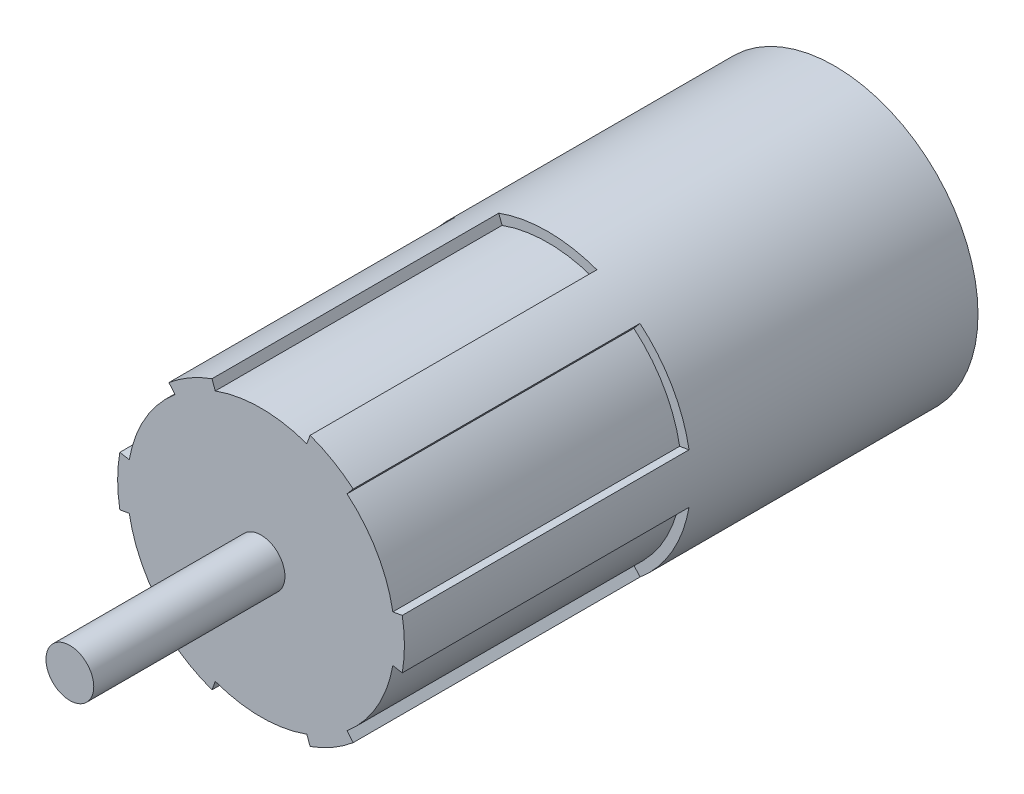
ISO-10303-21;
HEADER;
FILE_DESCRIPTION(('STEP AP214'),'2;1');
FILE_NAME('part.step','',(''),(''),'','','');
FILE_SCHEMA(('AUTOMOTIVE_DESIGN { 1 0 10303 214 1 1 1 1 }'));
ENDSEC;
DATA;
#1=APPLICATION_CONTEXT('core data for automotive mechanical design processes');
#2=APPLICATION_PROTOCOL_DEFINITION('international standard','automotive_design',2000,#1);
#3=PRODUCT_CONTEXT('',#1,'mechanical');
#4=PRODUCT('Part','Part','',(#3));
#5=PRODUCT_RELATED_PRODUCT_CATEGORY('part','',(#4));
#6=PRODUCT_DEFINITION_FORMATION('','',#4);
#7=PRODUCT_DEFINITION_CONTEXT('part definition',#1,'design');
#8=PRODUCT_DEFINITION('design','',#6,#7);
#9=PRODUCT_DEFINITION_SHAPE('','',#8);
#10=(LENGTH_UNIT() NAMED_UNIT(*) SI_UNIT(.MILLI.,.METRE.));
#11=(NAMED_UNIT(*) PLANE_ANGLE_UNIT() SI_UNIT($,.RADIAN.));
#12=(NAMED_UNIT(*) SI_UNIT($,.STERADIAN.) SOLID_ANGLE_UNIT());
#13=UNCERTAINTY_MEASURE_WITH_UNIT(LENGTH_MEASURE(1.E-05),#10,'distance_accuracy_value','');
#14=(GEOMETRIC_REPRESENTATION_CONTEXT(3) GLOBAL_UNCERTAINTY_ASSIGNED_CONTEXT((#13)) GLOBAL_UNIT_ASSIGNED_CONTEXT((#10,
#11,#12)) REPRESENTATION_CONTEXT('',''));
#15=CARTESIAN_POINT('',(0.,0.,0.));
#16=DIRECTION('',(0.,0.,1.));
#17=DIRECTION('',(1.,0.,0.));
#18=AXIS2_PLACEMENT_3D('',#15,#16,#17);
#19=CARTESIAN_POINT('',(0.,0.,30.));
#20=DIRECTION('',(0.,0.,-1.));
#21=DIRECTION('',(-1.,0.,0.));
#22=AXIS2_PLACEMENT_3D('',#19,#20,#21);
#23=CYLINDRICAL_SURFACE('',#22,15.);
#24=CARTESIAN_POINT('',(0.,0.,30.));
#25=DIRECTION('',(0.,0.,1.));
#26=DIRECTION('',(1.,0.,0.));
#27=AXIS2_PLACEMENT_3D('',#24,#25,#26);
#28=CIRCLE('',#27,15.);
#29=CARTESIAN_POINT('',(-14.7721162951831,2.60472266500412,30.));
#30=VERTEX_POINT('',#29);
#31=CARTESIAN_POINT('',(-14.7721162951831,-2.60472266500381,30.));
#32=VERTEX_POINT('',#31);
#33=EDGE_CURVE('E451',#30,#32,#28,.T.);
#34=ORIENTED_EDGE('',*,*,#33,.F.);
#35=DIRECTION('',(0.,0.,1.));
#36=VECTOR('',#35,1.);
#37=CARTESIAN_POINT('',(-14.7721162951831,2.60472266500412,0.));
#38=LINE('',#37,#36);
#39=CARTESIAN_POINT('',(-14.7721162951831,2.60472266500412,0.));
#40=VERTEX_POINT('',#39);
#41=EDGE_CURVE('E359',#40,#30,#38,.T.);
#42=ORIENTED_EDGE('',*,*,#41,.F.);
#43=CARTESIAN_POINT('',(0.,0.,0.));
#44=DIRECTION('',(0.,0.,1.));
#45=DIRECTION('',(-0.50000000000001,-0.866025403784433,0.));
#46=AXIS2_PLACEMENT_3D('',#43,#44,#45);
#47=CIRCLE('',#46,15.);
#48=CARTESIAN_POINT('',(-9.64181414529795,11.4906666467848,0.));
#49=VERTEX_POINT('',#48);
#50=EDGE_CURVE('E341',#49,#40,#47,.T.);
#51=ORIENTED_EDGE('',*,*,#50,.F.);
#52=DIRECTION('',(0.,0.,1.));
#53=VECTOR('',#52,1.);
#54=CARTESIAN_POINT('',(-9.64181414529795,11.4906666467848,0.));
#55=LINE('',#54,#53);
#56=CARTESIAN_POINT('',(-9.64181414529795,11.4906666467848,30.));
#57=VERTEX_POINT('',#56);
#58=EDGE_CURVE('E362',#49,#57,#55,.T.);
#59=ORIENTED_EDGE('',*,*,#58,.T.);
#60=CARTESIAN_POINT('',(-5.13030214988504,14.0953893117886,30.));
#61=VERTEX_POINT('',#60);
#62=EDGE_CURVE('E51',#61,#57,#28,.T.);
#63=ORIENTED_EDGE('',*,*,#62,.F.);
#64=DIRECTION('',(0.,0.,1.));
#65=VECTOR('',#64,1.);
#66=CARTESIAN_POINT('',(-5.13030214988504,14.0953893117886,0.));
#67=LINE('',#66,#65);
#68=CARTESIAN_POINT('',(-5.13030214988504,14.0953893117886,0.));
#69=VERTEX_POINT('',#68);
#70=EDGE_CURVE('E437',#69,#61,#67,.T.);
#71=ORIENTED_EDGE('',*,*,#70,.F.);
#72=CARTESIAN_POINT('',(0.,0.,0.));
#73=DIRECTION('',(0.,0.,1.));
#74=DIRECTION('',(-1.,0.,0.));
#75=AXIS2_PLACEMENT_3D('',#72,#73,#74);
#76=CIRCLE('',#75,15.);
#77=CARTESIAN_POINT('',(5.13030214988504,14.0953893117886,0.));
#78=VERTEX_POINT('',#77);
#79=EDGE_CURVE('E416',#78,#69,#76,.T.);
#80=ORIENTED_EDGE('',*,*,#79,.F.);
#81=DIRECTION('',(0.,0.,1.));
#82=VECTOR('',#81,1.);
#83=CARTESIAN_POINT('',(5.13030214988504,14.0953893117886,0.));
#84=LINE('',#83,#82);
#85=CARTESIAN_POINT('',(5.13030214988504,14.0953893117886,30.));
#86=VERTEX_POINT('',#85);
#87=EDGE_CURVE('E440',#78,#86,#84,.T.);
#88=ORIENTED_EDGE('',*,*,#87,.T.);
#89=CARTESIAN_POINT('',(9.64181414529811,11.4906666467847,30.));
#90=VERTEX_POINT('',#89);
#91=EDGE_CURVE('E452',#90,#86,#28,.T.);
#92=ORIENTED_EDGE('',*,*,#91,.F.);
#93=DIRECTION('',(0.,0.,1.));
#94=VECTOR('',#93,1.);
#95=CARTESIAN_POINT('',(9.64181414529811,11.4906666467847,0.));
#96=LINE('',#95,#94);
#97=CARTESIAN_POINT('',(9.64181414529811,11.4906666467847,0.));
#98=VERTEX_POINT('',#97);
#99=EDGE_CURVE('E397',#98,#90,#96,.T.);
#100=ORIENTED_EDGE('',*,*,#99,.F.);
#101=CARTESIAN_POINT('',(0.,0.,0.));
#102=DIRECTION('',(0.,0.,1.));
#103=DIRECTION('',(-0.499999999999998,0.86602540378444,0.));
#104=AXIS2_PLACEMENT_3D('',#101,#102,#103);
#105=CIRCLE('',#104,15.);
#106=CARTESIAN_POINT('',(14.7721162951831,2.60472266500392,0.));
#107=VERTEX_POINT('',#106);
#108=EDGE_CURVE('E377',#107,#98,#105,.T.);
#109=ORIENTED_EDGE('',*,*,#108,.F.);
#110=DIRECTION('',(0.,0.,1.));
#111=VECTOR('',#110,1.);
#112=CARTESIAN_POINT('',(14.7721162951831,2.60472266500392,0.));
#113=LINE('',#112,#111);
#114=CARTESIAN_POINT('',(14.7721162951831,2.60472266500392,30.));
#115=VERTEX_POINT('',#114);
#116=EDGE_CURVE('E400',#107,#115,#113,.T.);
#117=ORIENTED_EDGE('',*,*,#116,.T.);
#118=CARTESIAN_POINT('',(14.7721162951831,-2.60472266500402,30.));
#119=VERTEX_POINT('',#118);
#120=EDGE_CURVE('E461',#119,#115,#28,.T.);
#121=ORIENTED_EDGE('',*,*,#120,.F.);
#122=DIRECTION('',(0.,0.,1.));
#123=VECTOR('',#122,1.);
#124=CARTESIAN_POINT('',(14.7721162951831,-2.60472266500402,0.));
#125=LINE('',#124,#123);
#126=CARTESIAN_POINT('',(14.7721162951831,-2.60472266500402,0.));
#127=VERTEX_POINT('',#126);
#128=EDGE_CURVE('E251',#127,#119,#125,.T.);
#129=ORIENTED_EDGE('',*,*,#128,.F.);
#130=CARTESIAN_POINT('',(0.,0.,0.));
#131=DIRECTION('',(0.,0.,1.));
#132=DIRECTION('',(0.500000000000004,0.866025403784436,0.));
#133=AXIS2_PLACEMENT_3D('',#130,#131,#132);
#134=CIRCLE('',#133,15.);
#135=CARTESIAN_POINT('',(9.64181414529803,-11.4906666467847,0.));
#136=VERTEX_POINT('',#135);
#137=EDGE_CURVE('E226',#136,#127,#134,.T.);
#138=ORIENTED_EDGE('',*,*,#137,.F.);
#139=DIRECTION('',(0.,0.,1.));
#140=VECTOR('',#139,1.);
#141=CARTESIAN_POINT('',(9.64181414529803,-11.4906666467847,0.));
#142=LINE('',#141,#140);
#143=CARTESIAN_POINT('',(9.64181414529803,-11.4906666467847,30.));
#144=VERTEX_POINT('',#143);
#145=EDGE_CURVE('E216',#136,#144,#142,.T.);
#146=ORIENTED_EDGE('',*,*,#145,.T.);
#147=CARTESIAN_POINT('',(5.13030214988504,-14.0953893117886,30.));
#148=VERTEX_POINT('',#147);
#149=EDGE_CURVE('E468',#148,#144,#28,.T.);
#150=ORIENTED_EDGE('',*,*,#149,.F.);
#151=DIRECTION('',(0.,0.,1.));
#152=VECTOR('',#151,1.);
#153=CARTESIAN_POINT('',(5.13030214988504,-14.0953893117886,0.));
#154=LINE('',#153,#152);
#155=CARTESIAN_POINT('',(5.13030214988504,-14.0953893117886,0.));
#156=VERTEX_POINT('',#155);
#157=EDGE_CURVE('E285',#156,#148,#154,.T.);
#158=ORIENTED_EDGE('',*,*,#157,.F.);
#159=CARTESIAN_POINT('',(0.,0.,0.));
#160=DIRECTION('',(0.,0.,1.));
#161=DIRECTION('',(1.,0.,0.));
#162=AXIS2_PLACEMENT_3D('',#159,#160,#161);
#163=CIRCLE('',#162,15.);
#164=CARTESIAN_POINT('',(-5.13030214988504,-14.0953893117886,0.));
#165=VERTEX_POINT('',#164);
#166=EDGE_CURVE('E265',#165,#156,#163,.T.);
#167=ORIENTED_EDGE('',*,*,#166,.F.);
#168=DIRECTION('',(0.,0.,1.));
#169=VECTOR('',#168,1.);
#170=CARTESIAN_POINT('',(-5.13030214988504,-14.0953893117886,0.));
#171=LINE('',#170,#169);
#172=CARTESIAN_POINT('',(-5.13030214988504,-14.0953893117886,30.));
#173=VERTEX_POINT('',#172);
#174=EDGE_CURVE('E288',#165,#173,#171,.T.);
#175=ORIENTED_EDGE('',*,*,#174,.T.);
#176=CARTESIAN_POINT('',(-9.64181414529819,-11.4906666467846,30.));
#177=VERTEX_POINT('',#176);
#178=EDGE_CURVE('E459',#177,#173,#28,.T.);
#179=ORIENTED_EDGE('',*,*,#178,.F.);
#180=DIRECTION('',(0.,0.,1.));
#181=VECTOR('',#180,1.);
#182=CARTESIAN_POINT('',(-9.64181414529819,-11.4906666467846,0.));
#183=LINE('',#182,#181);
#184=CARTESIAN_POINT('',(-9.64181414529819,-11.4906666467846,0.));
#185=VERTEX_POINT('',#184);
#186=EDGE_CURVE('E323',#185,#177,#183,.T.);
#187=ORIENTED_EDGE('',*,*,#186,.F.);
#188=CARTESIAN_POINT('',(0.,0.,0.));
#189=DIRECTION('',(0.,0.,1.));
#190=DIRECTION('',(0.499999999999992,-0.866025403784443,0.));
#191=AXIS2_PLACEMENT_3D('',#188,#189,#190);
#192=CIRCLE('',#191,15.);
#193=CARTESIAN_POINT('',(-14.7721162951831,-2.60472266500381,0.));
#194=VERTEX_POINT('',#193);
#195=EDGE_CURVE('E304',#194,#185,#192,.T.);
#196=ORIENTED_EDGE('',*,*,#195,.F.);
#197=DIRECTION('',(0.,0.,1.));
#198=VECTOR('',#197,1.);
#199=CARTESIAN_POINT('',(-14.7721162951831,-2.60472266500381,0.));
#200=LINE('',#199,#198);
#201=EDGE_CURVE('E326',#194,#32,#200,.T.);
#202=ORIENTED_EDGE('',*,*,#201,.T.);
#203=EDGE_LOOP('',(#34,#42,#51,#59,#63,#71,#80,#88,#92,#100,#109,#117,#121,#129,#138,#146,#150,
#158,#167,#175,#179,#187,#196,#202));
#204=FACE_BOUND('',#203,.T.);
#205=CARTESIAN_POINT('',(0.,0.,-30.));
#206=DIRECTION('',(0.,0.,1.));
#207=DIRECTION('',(1.,0.,0.));
#208=AXIS2_PLACEMENT_3D('',#205,#206,#207);
#209=CIRCLE('',#208,15.);
#210=CARTESIAN_POINT('',(15.,0.,-30.));
#211=VERTEX_POINT('',#210);
#212=EDGE_CURVE('E45',#211,#211,#209,.T.);
#213=ORIENTED_EDGE('',*,*,#212,.T.);
#214=EDGE_LOOP('',(#213));
#215=FACE_BOUND('',#214,.T.);
#216=ADVANCED_FACE('F42',(#204,#215),#23,.T.);
#217=CARTESIAN_POINT('',(0.,0.,30.));
#218=DIRECTION('',(0.,0.,1.));
#219=DIRECTION('',(1.,0.,0.));
#220=AXIS2_PLACEMENT_3D('',#217,#218,#219);
#221=PLANE('',#220);
#222=DIRECTION('',(0.984807753012206,-0.173648177666942,0.));
#223=VECTOR('',#222,1.);
#224=CARTESIAN_POINT('',(-13.7873085421709,2.43107448733718,30.));
#225=LINE('',#224,#223);
#226=CARTESIAN_POINT('',(-13.7873085421709,2.43107448733718,30.));
#227=VERTEX_POINT('',#226);
#228=EDGE_CURVE('E337',#30,#227,#225,.T.);
#229=ORIENTED_EDGE('',*,*,#228,.F.);
#230=ORIENTED_EDGE('',*,*,#33,.T.);
#231=DIRECTION('',(-0.98480775301221,-0.173648177666921,0.));
#232=VECTOR('',#231,1.);
#233=CARTESIAN_POINT('',(-13.7873085421709,-2.43107448733689,30.));
#234=LINE('',#233,#232);
#235=CARTESIAN_POINT('',(-13.7873085421709,-2.43107448733689,30.));
#236=VERTEX_POINT('',#235);
#237=EDGE_CURVE('E314',#236,#32,#234,.T.);
#238=ORIENTED_EDGE('',*,*,#237,.F.);
#239=CARTESIAN_POINT('',(0.,0.,30.));
#240=DIRECTION('',(0.,0.,-1.));
#241=DIRECTION('',(0.499999999999992,-0.866025403784443,0.));
#242=AXIS2_PLACEMENT_3D('',#239,#240,#241);
#243=CIRCLE('',#242,14.);
#244=CARTESIAN_POINT('',(-8.99902653561164,-10.7246222036656,30.));
#245=VERTEX_POINT('',#244);
#246=EDGE_CURVE('E67',#245,#236,#243,.T.);
#247=ORIENTED_EDGE('',*,*,#246,.F.);
#248=DIRECTION('',(0.642787609686546,0.766044443118972,0.));
#249=VECTOR('',#248,1.);
#250=CARTESIAN_POINT('',(-8.99902653561164,-10.7246222036656,30.));
#251=LINE('',#250,#249);
#252=EDGE_CURVE('E300',#177,#245,#251,.T.);
#253=ORIENTED_EDGE('',*,*,#252,.F.);
#254=ORIENTED_EDGE('',*,*,#178,.T.);
#255=DIRECTION('',(-0.342020143325669,-0.939692620785908,0.));
#256=VECTOR('',#255,1.);
#257=CARTESIAN_POINT('',(-4.78828200655937,-13.1556966910027,30.));
#258=LINE('',#257,#256);
#259=CARTESIAN_POINT('',(-4.78828200655937,-13.1556966910027,30.));
#260=VERTEX_POINT('',#259);
#261=EDGE_CURVE('E276',#260,#173,#258,.T.);
#262=ORIENTED_EDGE('',*,*,#261,.F.);
#263=CARTESIAN_POINT('',(0.,0.,30.));
#264=DIRECTION('',(0.,0.,-1.));
#265=DIRECTION('',(1.,0.,0.));
#266=AXIS2_PLACEMENT_3D('',#263,#264,#265);
#267=CIRCLE('',#266,14.);
#268=CARTESIAN_POINT('',(4.78828200655937,-13.1556966910027,30.));
#269=VERTEX_POINT('',#268);
#270=EDGE_CURVE('E273',#269,#260,#267,.T.);
#271=ORIENTED_EDGE('',*,*,#270,.F.);
#272=DIRECTION('',(-0.342020143325669,0.939692620785908,0.));
#273=VECTOR('',#272,1.);
#274=CARTESIAN_POINT('',(4.78828200655937,-13.1556966910027,30.));
#275=LINE('',#274,#273);
#276=EDGE_CURVE('E261',#148,#269,#275,.T.);
#277=ORIENTED_EDGE('',*,*,#276,.F.);
#278=ORIENTED_EDGE('',*,*,#149,.T.);
#279=DIRECTION('',(0.642787609686536,-0.766044443118981,0.));
#280=VECTOR('',#279,1.);
#281=CARTESIAN_POINT('',(8.9990265356115,-10.7246222036657,30.));
#282=LINE('',#281,#280);
#283=CARTESIAN_POINT('',(8.9990265356115,-10.7246222036657,30.));
#284=VERTEX_POINT('',#283);
#285=EDGE_CURVE('E235',#284,#144,#282,.T.);
#286=ORIENTED_EDGE('',*,*,#285,.F.);
#287=CARTESIAN_POINT('',(0.,0.,30.));
#288=DIRECTION('',(0.,0.,-1.));
#289=DIRECTION('',(0.500000000000004,0.866025403784436,0.));
#290=AXIS2_PLACEMENT_3D('',#287,#288,#289);
#291=CIRCLE('',#290,14.);
#292=CARTESIAN_POINT('',(13.7873085421709,-2.43107448733708,30.));
#293=VERTEX_POINT('',#292);
#294=EDGE_CURVE('E212',#293,#284,#291,.T.);
#295=ORIENTED_EDGE('',*,*,#294,.F.);
#296=DIRECTION('',(-0.984807753012207,0.173648177666935,0.));
#297=VECTOR('',#296,1.);
#298=CARTESIAN_POINT('',(13.7873085421709,-2.43107448733708,30.));
#299=LINE('',#298,#297);
#300=EDGE_CURVE('E231',#119,#293,#299,.T.);
#301=ORIENTED_EDGE('',*,*,#300,.F.);
#302=ORIENTED_EDGE('',*,*,#120,.T.);
#303=DIRECTION('',(0.984807753012209,0.173648177666928,0.));
#304=VECTOR('',#303,1.);
#305=CARTESIAN_POINT('',(13.7873085421709,2.43107448733699,30.));
#306=LINE('',#305,#304);
#307=CARTESIAN_POINT('',(13.7873085421709,2.43107448733699,30.));
#308=VERTEX_POINT('',#307);
#309=EDGE_CURVE('E387',#308,#115,#306,.T.);
#310=ORIENTED_EDGE('',*,*,#309,.F.);
#311=CARTESIAN_POINT('',(0.,0.,30.));
#312=DIRECTION('',(0.,0.,-1.));
#313=DIRECTION('',(-0.499999999999998,0.86602540378444,0.));
#314=AXIS2_PLACEMENT_3D('',#311,#312,#313);
#315=CIRCLE('',#314,14.);
#316=CARTESIAN_POINT('',(8.99902653561157,10.7246222036657,30.));
#317=VERTEX_POINT('',#316);
#318=EDGE_CURVE('E250',#317,#308,#315,.T.);
#319=ORIENTED_EDGE('',*,*,#318,.F.);
#320=DIRECTION('',(-0.642787609686541,-0.766044443118977,0.));
#321=VECTOR('',#320,1.);
#322=CARTESIAN_POINT('',(8.99902653561157,10.7246222036657,30.));
#323=LINE('',#322,#321);
#324=EDGE_CURVE('E373',#90,#317,#323,.T.);
#325=ORIENTED_EDGE('',*,*,#324,.F.);
#326=ORIENTED_EDGE('',*,*,#91,.T.);
#327=DIRECTION('',(0.342020143325669,0.939692620785908,0.));
#328=VECTOR('',#327,1.);
#329=CARTESIAN_POINT('',(4.78828200655937,13.1556966910027,30.));
#330=LINE('',#329,#328);
#331=CARTESIAN_POINT('',(4.78828200655937,13.1556966910027,30.));
#332=VERTEX_POINT('',#331);
#333=EDGE_CURVE('E426',#332,#86,#330,.T.);
#334=ORIENTED_EDGE('',*,*,#333,.F.);
#335=CARTESIAN_POINT('',(0.,0.,30.));
#336=DIRECTION('',(0.,0.,-1.));
#337=DIRECTION('',(-1.,0.,0.));
#338=AXIS2_PLACEMENT_3D('',#335,#336,#337);
#339=CIRCLE('',#338,14.);
#340=CARTESIAN_POINT('',(-4.78828200655937,13.1556966910027,30.));
#341=VERTEX_POINT('',#340);
#342=EDGE_CURVE('E396',#341,#332,#339,.T.);
#343=ORIENTED_EDGE('',*,*,#342,.F.);
#344=DIRECTION('',(0.342020143325669,-0.939692620785908,0.));
#345=VECTOR('',#344,1.);
#346=CARTESIAN_POINT('',(-4.78828200655937,13.1556966910027,30.));
#347=LINE('',#346,#345);
#348=EDGE_CURVE('E412',#61,#341,#347,.T.);
#349=ORIENTED_EDGE('',*,*,#348,.F.);
#350=ORIENTED_EDGE('',*,*,#62,.T.);
#351=DIRECTION('',(-0.64278760968653,0.766044443118986,0.));
#352=VECTOR('',#351,1.);
#353=CARTESIAN_POINT('',(-8.99902653561142,10.7246222036658,30.));
#354=LINE('',#353,#352);
#355=CARTESIAN_POINT('',(-8.99902653561142,10.7246222036658,30.));
#356=VERTEX_POINT('',#355);
#357=EDGE_CURVE('E351',#356,#57,#354,.T.);
#358=ORIENTED_EDGE('',*,*,#357,.F.);
#359=CARTESIAN_POINT('',(0.,0.,30.));
#360=DIRECTION('',(0.,0.,-1.));
#361=DIRECTION('',(-0.50000000000001,-0.866025403784433,0.));
#362=AXIS2_PLACEMENT_3D('',#359,#360,#361);
#363=CIRCLE('',#362,14.);
#364=EDGE_CURVE('E59',#227,#356,#363,.T.);
#365=ORIENTED_EDGE('',*,*,#364,.F.);
#366=EDGE_LOOP('',(#229,#230,#238,#247,#253,#254,#262,#271,#277,#278,#286,#295,#301,#302,#310,
#319,#325,#326,#334,#343,#349,#350,#358,#365));
#367=FACE_BOUND('',#366,.T.);
#368=CARTESIAN_POINT('',(0.,0.,30.));
#369=DIRECTION('',(0.,0.,1.));
#370=DIRECTION('',(1.,0.,0.));
#371=AXIS2_PLACEMENT_3D('',#368,#369,#370);
#372=CIRCLE('',#371,2.5);
#373=CARTESIAN_POINT('',(2.5,0.,30.));
#374=VERTEX_POINT('',#373);
#375=EDGE_CURVE('E11',#374,#374,#372,.T.);
#376=ORIENTED_EDGE('',*,*,#375,.F.);
#377=EDGE_LOOP('',(#376));
#378=FACE_BOUND('',#377,.T.);
#379=ADVANCED_FACE('F476',(#367,#378),#221,.T.);
#380=CARTESIAN_POINT('',(0.,0.,-30.));
#381=DIRECTION('',(0.,0.,1.));
#382=DIRECTION('',(1.,0.,0.));
#383=AXIS2_PLACEMENT_3D('',#380,#381,#382);
#384=PLANE('',#383);
#385=ORIENTED_EDGE('',*,*,#212,.F.);
#386=EDGE_LOOP('',(#385));
#387=FACE_BOUND('',#386,.T.);
#388=ADVANCED_FACE('F473',(#387),#384,.F.);
#389=CARTESIAN_POINT('',(0.,0.,50.));
#390=DIRECTION('',(0.,0.,-1.));
#391=DIRECTION('',(-1.,0.,0.));
#392=AXIS2_PLACEMENT_3D('',#389,#390,#391);
#393=CYLINDRICAL_SURFACE('',#392,2.5);
#394=CARTESIAN_POINT('',(0.,0.,50.));
#395=DIRECTION('',(0.,0.,1.));
#396=DIRECTION('',(1.,0.,0.));
#397=AXIS2_PLACEMENT_3D('',#394,#395,#396);
#398=CIRCLE('',#397,2.5);
#399=CARTESIAN_POINT('',(2.5,0.,50.));
#400=VERTEX_POINT('',#399);
#401=EDGE_CURVE('E436',#400,#400,#398,.T.);
#402=ORIENTED_EDGE('',*,*,#401,.F.);
#403=EDGE_LOOP('',(#402));
#404=FACE_BOUND('',#403,.T.);
#405=ORIENTED_EDGE('',*,*,#375,.T.);
#406=EDGE_LOOP('',(#405));
#407=FACE_BOUND('',#406,.T.);
#408=ADVANCED_FACE('F475',(#404,#407),#393,.T.);
#409=CARTESIAN_POINT('',(0.,0.,50.));
#410=DIRECTION('',(0.,0.,1.));
#411=DIRECTION('',(1.,0.,0.));
#412=AXIS2_PLACEMENT_3D('',#409,#410,#411);
#413=PLANE('',#412);
#414=ORIENTED_EDGE('',*,*,#401,.T.);
#415=EDGE_LOOP('',(#414));
#416=FACE_BOUND('',#415,.T.);
#417=ADVANCED_FACE('F481',(#416),#413,.T.);
#418=CARTESIAN_POINT('',(0.,0.,0.));
#419=DIRECTION('',(0.,0.,1.));
#420=DIRECTION('',(1.,0.,0.));
#421=AXIS2_PLACEMENT_3D('',#418,#419,#420);
#422=CYLINDRICAL_SURFACE('',#421,14.);
#423=ORIENTED_EDGE('',*,*,#342,.T.);
#424=DIRECTION('',(0.,0.,1.));
#425=VECTOR('',#424,1.);
#426=CARTESIAN_POINT('',(4.78828200655937,13.1556966910027,0.));
#427=LINE('',#426,#425);
#428=CARTESIAN_POINT('',(4.78828200655937,13.1556966910027,0.));
#429=VERTEX_POINT('',#428);
#430=EDGE_CURVE('E423',#429,#332,#427,.T.);
#431=ORIENTED_EDGE('',*,*,#430,.F.);
#432=CARTESIAN_POINT('',(0.,0.,0.));
#433=DIRECTION('',(0.,0.,-1.));
#434=DIRECTION('',(-1.,0.,0.));
#435=AXIS2_PLACEMENT_3D('',#432,#433,#434);
#436=CIRCLE('',#435,14.);
#437=CARTESIAN_POINT('',(-4.78828200655937,13.1556966910027,0.));
#438=VERTEX_POINT('',#437);
#439=EDGE_CURVE('E407',#438,#429,#436,.T.);
#440=ORIENTED_EDGE('',*,*,#439,.F.);
#441=DIRECTION('',(0.,0.,1.));
#442=VECTOR('',#441,1.);
#443=CARTESIAN_POINT('',(-4.78828200655937,13.1556966910027,0.));
#444=LINE('',#443,#442);
#445=EDGE_CURVE('E433',#438,#341,#444,.T.);
#446=ORIENTED_EDGE('',*,*,#445,.T.);
#447=EDGE_LOOP('',(#423,#431,#440,#446));
#448=FACE_BOUND('',#447,.T.);
#449=ADVANCED_FACE('F544',(#448),#422,.T.);
#450=CARTESIAN_POINT('',(-4.78828200655937,13.1556966910027,0.));
#451=DIRECTION('',(-0.939692620785908,-0.342020143325669,0.));
#452=DIRECTION('',(0.342020143325669,-0.939692620785908,0.));
#453=AXIS2_PLACEMENT_3D('',#450,#451,#452);
#454=PLANE('',#453);
#455=ORIENTED_EDGE('',*,*,#348,.T.);
#456=ORIENTED_EDGE('',*,*,#445,.F.);
#457=DIRECTION('',(0.342020143325669,-0.939692620785908,0.));
#458=VECTOR('',#457,1.);
#459=CARTESIAN_POINT('',(-4.78828200655937,13.1556966910027,0.));
#460=LINE('',#459,#458);
#461=EDGE_CURVE('E419',#69,#438,#460,.T.);
#462=ORIENTED_EDGE('',*,*,#461,.F.);
#463=ORIENTED_EDGE('',*,*,#70,.T.);
#464=EDGE_LOOP('',(#455,#456,#462,#463));
#465=FACE_BOUND('',#464,.T.);
#466=ADVANCED_FACE('F541',(#465),#454,.F.);
#467=CARTESIAN_POINT('',(4.78828200655937,13.1556966910027,0.));
#468=DIRECTION('',(0.939692620785908,-0.342020143325669,0.));
#469=DIRECTION('',(0.342020143325669,0.939692620785908,0.));
#470=AXIS2_PLACEMENT_3D('',#467,#468,#469);
#471=PLANE('',#470);
#472=ORIENTED_EDGE('',*,*,#333,.T.);
#473=ORIENTED_EDGE('',*,*,#87,.F.);
#474=DIRECTION('',(0.342020143325669,0.939692620785908,0.));
#475=VECTOR('',#474,1.);
#476=CARTESIAN_POINT('',(4.78828200655937,13.1556966910027,0.));
#477=LINE('',#476,#475);
#478=EDGE_CURVE('E411',#429,#78,#477,.T.);
#479=ORIENTED_EDGE('',*,*,#478,.F.);
#480=ORIENTED_EDGE('',*,*,#430,.T.);
#481=EDGE_LOOP('',(#472,#473,#479,#480));
#482=FACE_BOUND('',#481,.T.);
#483=ADVANCED_FACE('F539',(#482),#471,.F.);
#484=CARTESIAN_POINT('',(0.,0.,0.));
#485=DIRECTION('',(0.,0.,-1.));
#486=DIRECTION('',(-1.,0.,0.));
#487=AXIS2_PLACEMENT_3D('',#484,#485,#486);
#488=PLANE('',#487);
#489=ORIENTED_EDGE('',*,*,#439,.T.);
#490=ORIENTED_EDGE('',*,*,#478,.T.);
#491=ORIENTED_EDGE('',*,*,#79,.T.);
#492=ORIENTED_EDGE('',*,*,#461,.T.);
#493=EDGE_LOOP('',(#489,#490,#491,#492));
#494=FACE_BOUND('',#493,.T.);
#495=ADVANCED_FACE('F535',(#494),#488,.F.);
#496=CARTESIAN_POINT('',(0.,0.,0.));
#497=DIRECTION('',(0.,0.,1.));
#498=DIRECTION('',(1.,0.,0.));
#499=AXIS2_PLACEMENT_3D('',#496,#497,#498);
#500=CYLINDRICAL_SURFACE('',#499,14.);
#501=ORIENTED_EDGE('',*,*,#318,.T.);
#502=DIRECTION('',(0.,0.,1.));
#503=VECTOR('',#502,1.);
#504=CARTESIAN_POINT('',(13.7873085421709,2.43107448733699,0.));
#505=LINE('',#504,#503);
#506=CARTESIAN_POINT('',(13.7873085421709,2.43107448733699,0.));
#507=VERTEX_POINT('',#506);
#508=EDGE_CURVE('E384',#507,#308,#505,.T.);
#509=ORIENTED_EDGE('',*,*,#508,.F.);
#510=CARTESIAN_POINT('',(0.,0.,0.));
#511=DIRECTION('',(0.,0.,-1.));
#512=DIRECTION('',(-0.499999999999998,0.86602540378444,0.));
#513=AXIS2_PLACEMENT_3D('',#510,#511,#512);
#514=CIRCLE('',#513,14.);
#515=CARTESIAN_POINT('',(8.99902653561157,10.7246222036657,0.));
#516=VERTEX_POINT('',#515);
#517=EDGE_CURVE('E368',#516,#507,#514,.T.);
#518=ORIENTED_EDGE('',*,*,#517,.F.);
#519=DIRECTION('',(0.,0.,1.));
#520=VECTOR('',#519,1.);
#521=CARTESIAN_POINT('',(8.99902653561157,10.7246222036657,0.));
#522=LINE('',#521,#520);
#523=EDGE_CURVE('E393',#516,#317,#522,.T.);
#524=ORIENTED_EDGE('',*,*,#523,.T.);
#525=EDGE_LOOP('',(#501,#509,#518,#524));
#526=FACE_BOUND('',#525,.T.);
#527=ADVANCED_FACE('F528',(#526),#500,.T.);
#528=CARTESIAN_POINT('',(8.99902653561157,10.7246222036657,0.));
#529=DIRECTION('',(-0.766044443118977,0.642787609686541,0.));
#530=DIRECTION('',(-0.642787609686541,-0.766044443118977,0.));
#531=AXIS2_PLACEMENT_3D('',#528,#529,#530);
#532=PLANE('',#531);
#533=ORIENTED_EDGE('',*,*,#324,.T.);
#534=ORIENTED_EDGE('',*,*,#523,.F.);
#535=DIRECTION('',(-0.642787609686541,-0.766044443118977,0.));
#536=VECTOR('',#535,1.);
#537=CARTESIAN_POINT('',(8.99902653561157,10.7246222036657,0.));
#538=LINE('',#537,#536);
#539=EDGE_CURVE('E380',#98,#516,#538,.T.);
#540=ORIENTED_EDGE('',*,*,#539,.F.);
#541=ORIENTED_EDGE('',*,*,#99,.T.);
#542=EDGE_LOOP('',(#533,#534,#540,#541));
#543=FACE_BOUND('',#542,.T.);
#544=ADVANCED_FACE('F525',(#543),#532,.F.);
#545=CARTESIAN_POINT('',(13.7873085421709,2.43107448733699,0.));
#546=DIRECTION('',(0.173648177666928,-0.984807753012209,0.));
#547=DIRECTION('',(0.984807753012209,0.173648177666928,0.));
#548=AXIS2_PLACEMENT_3D('',#545,#546,#547);
#549=PLANE('',#548);
#550=ORIENTED_EDGE('',*,*,#309,.T.);
#551=ORIENTED_EDGE('',*,*,#116,.F.);
#552=DIRECTION('',(0.984807753012209,0.173648177666928,0.));
#553=VECTOR('',#552,1.);
#554=CARTESIAN_POINT('',(13.7873085421709,2.43107448733699,0.));
#555=LINE('',#554,#553);
#556=EDGE_CURVE('E372',#507,#107,#555,.T.);
#557=ORIENTED_EDGE('',*,*,#556,.F.);
#558=ORIENTED_EDGE('',*,*,#508,.T.);
#559=EDGE_LOOP('',(#550,#551,#557,#558));
#560=FACE_BOUND('',#559,.T.);
#561=ADVANCED_FACE('F523',(#560),#549,.F.);
#562=CARTESIAN_POINT('',(0.,0.,0.));
#563=DIRECTION('',(0.,0.,-1.));
#564=DIRECTION('',(-0.499999999999998,0.86602540378444,0.));
#565=AXIS2_PLACEMENT_3D('',#562,#563,#564);
#566=PLANE('',#565);
#567=ORIENTED_EDGE('',*,*,#517,.T.);
#568=ORIENTED_EDGE('',*,*,#556,.T.);
#569=ORIENTED_EDGE('',*,*,#108,.T.);
#570=ORIENTED_EDGE('',*,*,#539,.T.);
#571=EDGE_LOOP('',(#567,#568,#569,#570));
#572=FACE_BOUND('',#571,.T.);
#573=ADVANCED_FACE('F520',(#572),#566,.F.);
#574=CARTESIAN_POINT('',(0.,0.,0.));
#575=DIRECTION('',(0.,0.,1.));
#576=DIRECTION('',(1.,0.,0.));
#577=AXIS2_PLACEMENT_3D('',#574,#575,#576);
#578=CYLINDRICAL_SURFACE('',#577,14.);
#579=ORIENTED_EDGE('',*,*,#294,.T.);
#580=DIRECTION('',(0.,0.,1.));
#581=VECTOR('',#580,1.);
#582=CARTESIAN_POINT('',(8.9990265356115,-10.7246222036657,0.));
#583=LINE('',#582,#581);
#584=CARTESIAN_POINT('',(8.9990265356115,-10.7246222036657,0.));
#585=VERTEX_POINT('',#584);
#586=EDGE_CURVE('E205',#585,#284,#583,.T.);
#587=ORIENTED_EDGE('',*,*,#586,.F.);
#588=CARTESIAN_POINT('',(0.,0.,0.));
#589=DIRECTION('',(0.,0.,-1.));
#590=DIRECTION('',(0.500000000000004,0.866025403784436,0.));
#591=AXIS2_PLACEMENT_3D('',#588,#589,#590);
#592=CIRCLE('',#591,14.);
#593=CARTESIAN_POINT('',(13.7873085421709,-2.43107448733708,0.));
#594=VERTEX_POINT('',#593);
#595=EDGE_CURVE('E209',#594,#585,#592,.T.);
#596=ORIENTED_EDGE('',*,*,#595,.F.);
#597=DIRECTION('',(0.,0.,1.));
#598=VECTOR('',#597,1.);
#599=CARTESIAN_POINT('',(13.7873085421709,-2.43107448733708,0.));
#600=LINE('',#599,#598);
#601=EDGE_CURVE('E247',#594,#293,#600,.T.);
#602=ORIENTED_EDGE('',*,*,#601,.T.);
#603=EDGE_LOOP('',(#579,#587,#596,#602));
#604=FACE_BOUND('',#603,.T.);
#605=ADVANCED_FACE('F207',(#604),#578,.T.);
#606=CARTESIAN_POINT('',(13.7873085421709,-2.43107448733708,0.));
#607=DIRECTION('',(0.173648177666935,0.984807753012207,0.));
#608=DIRECTION('',(-0.984807753012207,0.173648177666935,0.));
#609=AXIS2_PLACEMENT_3D('',#606,#607,#608);
#610=PLANE('',#609);
#611=ORIENTED_EDGE('',*,*,#300,.T.);
#612=ORIENTED_EDGE('',*,*,#601,.F.);
#613=DIRECTION('',(-0.984807753012207,0.173648177666935,0.));
#614=VECTOR('',#613,1.);
#615=CARTESIAN_POINT('',(13.7873085421709,-2.43107448733708,0.));
#616=LINE('',#615,#614);
#617=EDGE_CURVE('E217',#127,#594,#616,.T.);
#618=ORIENTED_EDGE('',*,*,#617,.F.);
#619=ORIENTED_EDGE('',*,*,#128,.T.);
#620=EDGE_LOOP('',(#611,#612,#618,#619));
#621=FACE_BOUND('',#620,.T.);
#622=ADVANCED_FACE('F600',(#621),#610,.F.);
#623=CARTESIAN_POINT('',(8.9990265356115,-10.7246222036657,0.));
#624=DIRECTION('',(-0.766044443118981,-0.642787609686536,0.));
#625=DIRECTION('',(0.642787609686536,-0.766044443118981,0.));
#626=AXIS2_PLACEMENT_3D('',#623,#624,#625);
#627=PLANE('',#626);
#628=ORIENTED_EDGE('',*,*,#285,.T.);
#629=ORIENTED_EDGE('',*,*,#145,.F.);
#630=DIRECTION('',(0.642787609686536,-0.766044443118981,0.));
#631=VECTOR('',#630,1.);
#632=CARTESIAN_POINT('',(8.9990265356115,-10.7246222036657,0.));
#633=LINE('',#632,#631);
#634=EDGE_CURVE('E220',#585,#136,#633,.T.);
#635=ORIENTED_EDGE('',*,*,#634,.F.);
#636=ORIENTED_EDGE('',*,*,#586,.T.);
#637=EDGE_LOOP('',(#628,#629,#635,#636));
#638=FACE_BOUND('',#637,.T.);
#639=ADVANCED_FACE('F221',(#638),#627,.F.);
#640=CARTESIAN_POINT('',(0.,0.,0.));
#641=DIRECTION('',(0.,0.,-1.));
#642=DIRECTION('',(0.500000000000004,0.866025403784436,0.));
#643=AXIS2_PLACEMENT_3D('',#640,#641,#642);
#644=PLANE('',#643);
#645=ORIENTED_EDGE('',*,*,#595,.T.);
#646=ORIENTED_EDGE('',*,*,#634,.T.);
#647=ORIENTED_EDGE('',*,*,#137,.T.);
#648=ORIENTED_EDGE('',*,*,#617,.T.);
#649=EDGE_LOOP('',(#645,#646,#647,#648));
#650=FACE_BOUND('',#649,.T.);
#651=ADVANCED_FACE('F228',(#650),#644,.F.);
#652=CARTESIAN_POINT('',(0.,0.,0.));
#653=DIRECTION('',(0.,0.,1.));
#654=DIRECTION('',(1.,0.,0.));
#655=AXIS2_PLACEMENT_3D('',#652,#653,#654);
#656=CYLINDRICAL_SURFACE('',#655,14.);
#657=ORIENTED_EDGE('',*,*,#270,.T.);
#658=DIRECTION('',(0.,0.,1.));
#659=VECTOR('',#658,1.);
#660=CARTESIAN_POINT('',(-4.78828200655937,-13.1556966910027,0.));
#661=LINE('',#660,#659);
#662=CARTESIAN_POINT('',(-4.78828200655937,-13.1556966910027,0.));
#663=VERTEX_POINT('',#662);
#664=EDGE_CURVE('E272',#663,#260,#661,.T.);
#665=ORIENTED_EDGE('',*,*,#664,.F.);
#666=CARTESIAN_POINT('',(0.,0.,0.));
#667=DIRECTION('',(0.,0.,-1.));
#668=DIRECTION('',(1.,0.,0.));
#669=AXIS2_PLACEMENT_3D('',#666,#667,#668);
#670=CIRCLE('',#669,14.);
#671=CARTESIAN_POINT('',(4.78828200655937,-13.1556966910027,0.));
#672=VERTEX_POINT('',#671);
#673=EDGE_CURVE('E256',#672,#663,#670,.T.);
#674=ORIENTED_EDGE('',*,*,#673,.F.);
#675=DIRECTION('',(0.,0.,1.));
#676=VECTOR('',#675,1.);
#677=CARTESIAN_POINT('',(4.78828200655937,-13.1556966910027,0.));
#678=LINE('',#677,#676);
#679=EDGE_CURVE('E244',#672,#269,#678,.T.);
#680=ORIENTED_EDGE('',*,*,#679,.T.);
#681=EDGE_LOOP('',(#657,#665,#674,#680));
#682=FACE_BOUND('',#681,.T.);
#683=ADVANCED_FACE('F620',(#682),#656,.T.);
#684=CARTESIAN_POINT('',(4.78828200655937,-13.1556966910027,0.));
#685=DIRECTION('',(0.939692620785908,0.342020143325669,0.));
#686=DIRECTION('',(-0.342020143325669,0.939692620785908,0.));
#687=AXIS2_PLACEMENT_3D('',#684,#685,#686);
#688=PLANE('',#687);
#689=ORIENTED_EDGE('',*,*,#276,.T.);
#690=ORIENTED_EDGE('',*,*,#679,.F.);
#691=DIRECTION('',(-0.342020143325669,0.939692620785908,0.));
#692=VECTOR('',#691,1.);
#693=CARTESIAN_POINT('',(4.78828200655937,-13.1556966910027,0.));
#694=LINE('',#693,#692);
#695=EDGE_CURVE('E268',#156,#672,#694,.T.);
#696=ORIENTED_EDGE('',*,*,#695,.F.);
#697=ORIENTED_EDGE('',*,*,#157,.T.);
#698=EDGE_LOOP('',(#689,#690,#696,#697));
#699=FACE_BOUND('',#698,.T.);
#700=ADVANCED_FACE('F627',(#699),#688,.F.);
#701=CARTESIAN_POINT('',(-4.78828200655937,-13.1556966910027,0.));
#702=DIRECTION('',(-0.939692620785908,0.342020143325669,0.));
#703=DIRECTION('',(-0.342020143325669,-0.939692620785908,0.));
#704=AXIS2_PLACEMENT_3D('',#701,#702,#703);
#705=PLANE('',#704);
#706=ORIENTED_EDGE('',*,*,#261,.T.);
#707=ORIENTED_EDGE('',*,*,#174,.F.);
#708=DIRECTION('',(-0.342020143325669,-0.939692620785908,0.));
#709=VECTOR('',#708,1.);
#710=CARTESIAN_POINT('',(-4.78828200655937,-13.1556966910027,0.));
#711=LINE('',#710,#709);
#712=EDGE_CURVE('E260',#663,#165,#711,.T.);
#713=ORIENTED_EDGE('',*,*,#712,.F.);
#714=ORIENTED_EDGE('',*,*,#664,.T.);
#715=EDGE_LOOP('',(#706,#707,#713,#714));
#716=FACE_BOUND('',#715,.T.);
#717=ADVANCED_FACE('F635',(#716),#705,.F.);
#718=CARTESIAN_POINT('',(0.,0.,0.));
#719=DIRECTION('',(0.,0.,-1.));
#720=DIRECTION('',(1.,0.,0.));
#721=AXIS2_PLACEMENT_3D('',#718,#719,#720);
#722=PLANE('',#721);
#723=ORIENTED_EDGE('',*,*,#673,.T.);
#724=ORIENTED_EDGE('',*,*,#712,.T.);
#725=ORIENTED_EDGE('',*,*,#166,.T.);
#726=ORIENTED_EDGE('',*,*,#695,.T.);
#727=EDGE_LOOP('',(#723,#724,#725,#726));
#728=FACE_BOUND('',#727,.T.);
#729=ADVANCED_FACE('F643',(#728),#722,.F.);
#730=CARTESIAN_POINT('',(0.,0.,0.));
#731=DIRECTION('',(0.,0.,1.));
#732=DIRECTION('',(1.,0.,0.));
#733=AXIS2_PLACEMENT_3D('',#730,#731,#732);
#734=CYLINDRICAL_SURFACE('',#733,14.);
#735=ORIENTED_EDGE('',*,*,#246,.T.);
#736=DIRECTION('',(0.,0.,1.));
#737=VECTOR('',#736,1.);
#738=CARTESIAN_POINT('',(-13.7873085421709,-2.43107448733689,0.));
#739=LINE('',#738,#737);
#740=CARTESIAN_POINT('',(-13.7873085421709,-2.43107448733689,0.));
#741=VERTEX_POINT('',#740);
#742=EDGE_CURVE('E311',#741,#236,#739,.T.);
#743=ORIENTED_EDGE('',*,*,#742,.F.);
#744=CARTESIAN_POINT('',(0.,0.,0.));
#745=DIRECTION('',(0.,0.,-1.));
#746=DIRECTION('',(0.499999999999992,-0.866025403784443,0.));
#747=AXIS2_PLACEMENT_3D('',#744,#745,#746);
#748=CIRCLE('',#747,14.);
#749=CARTESIAN_POINT('',(-8.99902653561164,-10.7246222036656,0.));
#750=VERTEX_POINT('',#749);
#751=EDGE_CURVE('E295',#750,#741,#748,.T.);
#752=ORIENTED_EDGE('',*,*,#751,.F.);
#753=DIRECTION('',(0.,0.,1.));
#754=VECTOR('',#753,1.);
#755=CARTESIAN_POINT('',(-8.99902653561164,-10.7246222036656,0.));
#756=LINE('',#755,#754);
#757=EDGE_CURVE('E277',#750,#245,#756,.T.);
#758=ORIENTED_EDGE('',*,*,#757,.T.);
#759=EDGE_LOOP('',(#735,#743,#752,#758));
#760=FACE_BOUND('',#759,.T.);
#761=ADVANCED_FACE('F651',(#760),#734,.T.);
#762=CARTESIAN_POINT('',(-8.99902653561164,-10.7246222036656,0.));
#763=DIRECTION('',(0.766044443118972,-0.642787609686546,0.));
#764=DIRECTION('',(0.642787609686546,0.766044443118972,0.));
#765=AXIS2_PLACEMENT_3D('',#762,#763,#764);
#766=PLANE('',#765);
#767=ORIENTED_EDGE('',*,*,#252,.T.);
#768=ORIENTED_EDGE('',*,*,#757,.F.);
#769=DIRECTION('',(0.642787609686546,0.766044443118972,0.));
#770=VECTOR('',#769,1.);
#771=CARTESIAN_POINT('',(-8.99902653561164,-10.7246222036656,0.));
#772=LINE('',#771,#770);
#773=EDGE_CURVE('E307',#185,#750,#772,.T.);
#774=ORIENTED_EDGE('',*,*,#773,.F.);
#775=ORIENTED_EDGE('',*,*,#186,.T.);
#776=EDGE_LOOP('',(#767,#768,#774,#775));
#777=FACE_BOUND('',#776,.T.);
#778=ADVANCED_FACE('F659',(#777),#766,.F.);
#779=CARTESIAN_POINT('',(-13.7873085421709,-2.43107448733689,0.));
#780=DIRECTION('',(-0.173648177666921,0.98480775301221,0.));
#781=DIRECTION('',(-0.98480775301221,-0.173648177666921,0.));
#782=AXIS2_PLACEMENT_3D('',#779,#780,#781);
#783=PLANE('',#782);
#784=ORIENTED_EDGE('',*,*,#237,.T.);
#785=ORIENTED_EDGE('',*,*,#201,.F.);
#786=DIRECTION('',(-0.98480775301221,-0.173648177666921,0.));
#787=VECTOR('',#786,1.);
#788=CARTESIAN_POINT('',(-13.7873085421709,-2.43107448733689,0.));
#789=LINE('',#788,#787);
#790=EDGE_CURVE('E299',#741,#194,#789,.T.);
#791=ORIENTED_EDGE('',*,*,#790,.F.);
#792=ORIENTED_EDGE('',*,*,#742,.T.);
#793=EDGE_LOOP('',(#784,#785,#791,#792));
#794=FACE_BOUND('',#793,.T.);
#795=ADVANCED_FACE('F515',(#794),#783,.F.);
#796=CARTESIAN_POINT('',(0.,0.,0.));
#797=DIRECTION('',(0.,0.,-1.));
#798=DIRECTION('',(0.499999999999992,-0.866025403784443,0.));
#799=AXIS2_PLACEMENT_3D('',#796,#797,#798);
#800=PLANE('',#799);
#801=ORIENTED_EDGE('',*,*,#751,.T.);
#802=ORIENTED_EDGE('',*,*,#790,.T.);
#803=ORIENTED_EDGE('',*,*,#195,.T.);
#804=ORIENTED_EDGE('',*,*,#773,.T.);
#805=EDGE_LOOP('',(#801,#802,#803,#804));
#806=FACE_BOUND('',#805,.T.);
#807=ADVANCED_FACE('F508',(#806),#800,.F.);
#808=CARTESIAN_POINT('',(0.,0.,0.));
#809=DIRECTION('',(0.,0.,1.));
#810=DIRECTION('',(1.,0.,0.));
#811=AXIS2_PLACEMENT_3D('',#808,#809,#810);
#812=CYLINDRICAL_SURFACE('',#811,14.);
#813=ORIENTED_EDGE('',*,*,#364,.T.);
#814=DIRECTION('',(0.,0.,1.));
#815=VECTOR('',#814,1.);
#816=CARTESIAN_POINT('',(-8.99902653561142,10.7246222036658,0.));
#817=LINE('',#816,#815);
#818=CARTESIAN_POINT('',(-8.99902653561142,10.7246222036658,0.));
#819=VERTEX_POINT('',#818);
#820=EDGE_CURVE('E348',#819,#356,#817,.T.);
#821=ORIENTED_EDGE('',*,*,#820,.F.);
#822=CARTESIAN_POINT('',(0.,0.,0.));
#823=DIRECTION('',(0.,0.,-1.));
#824=DIRECTION('',(-0.50000000000001,-0.866025403784433,0.));
#825=AXIS2_PLACEMENT_3D('',#822,#823,#824);
#826=CIRCLE('',#825,14.);
#827=CARTESIAN_POINT('',(-13.7873085421709,2.43107448733718,0.));
#828=VERTEX_POINT('',#827);
#829=EDGE_CURVE('E332',#828,#819,#826,.T.);
#830=ORIENTED_EDGE('',*,*,#829,.F.);
#831=DIRECTION('',(0.,0.,1.));
#832=VECTOR('',#831,1.);
#833=CARTESIAN_POINT('',(-13.7873085421709,2.43107448733718,0.));
#834=LINE('',#833,#832);
#835=EDGE_CURVE('E315',#828,#227,#834,.T.);
#836=ORIENTED_EDGE('',*,*,#835,.T.);
#837=EDGE_LOOP('',(#813,#821,#830,#836));
#838=FACE_BOUND('',#837,.T.);
#839=ADVANCED_FACE('F506',(#838),#812,.T.);
#840=CARTESIAN_POINT('',(-13.7873085421709,2.43107448733718,0.));
#841=DIRECTION('',(-0.173648177666942,-0.984807753012206,0.));
#842=DIRECTION('',(0.984807753012206,-0.173648177666942,0.));
#843=AXIS2_PLACEMENT_3D('',#840,#841,#842);
#844=PLANE('',#843);
#845=ORIENTED_EDGE('',*,*,#228,.T.);
#846=ORIENTED_EDGE('',*,*,#835,.F.);
#847=DIRECTION('',(0.984807753012206,-0.173648177666942,0.));
#848=VECTOR('',#847,1.);
#849=CARTESIAN_POINT('',(-13.7873085421709,2.43107448733718,0.));
#850=LINE('',#849,#848);
#851=EDGE_CURVE('E344',#40,#828,#850,.T.);
#852=ORIENTED_EDGE('',*,*,#851,.F.);
#853=ORIENTED_EDGE('',*,*,#41,.T.);
#854=EDGE_LOOP('',(#845,#846,#852,#853));
#855=FACE_BOUND('',#854,.T.);
#856=ADVANCED_FACE('F497',(#855),#844,.F.);
#857=CARTESIAN_POINT('',(-8.99902653561142,10.7246222036658,0.));
#858=DIRECTION('',(0.766044443118986,0.64278760968653,0.));
#859=DIRECTION('',(-0.64278760968653,0.766044443118986,0.));
#860=AXIS2_PLACEMENT_3D('',#857,#858,#859);
#861=PLANE('',#860);
#862=ORIENTED_EDGE('',*,*,#357,.T.);
#863=ORIENTED_EDGE('',*,*,#58,.F.);
#864=DIRECTION('',(-0.64278760968653,0.766044443118986,0.));
#865=VECTOR('',#864,1.);
#866=CARTESIAN_POINT('',(-8.99902653561142,10.7246222036658,0.));
#867=LINE('',#866,#865);
#868=EDGE_CURVE('E336',#819,#49,#867,.T.);
#869=ORIENTED_EDGE('',*,*,#868,.F.);
#870=ORIENTED_EDGE('',*,*,#820,.T.);
#871=EDGE_LOOP('',(#862,#863,#869,#870));
#872=FACE_BOUND('',#871,.T.);
#873=ADVANCED_FACE('F505',(#872),#861,.F.);
#874=CARTESIAN_POINT('',(0.,0.,0.));
#875=DIRECTION('',(0.,0.,-1.));
#876=DIRECTION('',(-0.50000000000001,-0.866025403784433,0.));
#877=AXIS2_PLACEMENT_3D('',#874,#875,#876);
#878=PLANE('',#877);
#879=ORIENTED_EDGE('',*,*,#829,.T.);
#880=ORIENTED_EDGE('',*,*,#868,.T.);
#881=ORIENTED_EDGE('',*,*,#50,.T.);
#882=ORIENTED_EDGE('',*,*,#851,.T.);
#883=EDGE_LOOP('',(#879,#880,#881,#882));
#884=FACE_BOUND('',#883,.T.);
#885=ADVANCED_FACE('F501',(#884),#878,.F.);
#886=CLOSED_SHELL('',(#216,#379,#388,#408,#417,#449,#466,#483,#495,#527,#544,#561,#573,#605,
#622,#639,#651,#683,#700,#717,#729,#761,#778,#795,#807,#839,#856,#873,#885));
#887=MANIFOLD_SOLID_BREP('B2',#886);
#888=ADVANCED_BREP_SHAPE_REPRESENTATION('',(#18,#887),#14);
#889=SHAPE_DEFINITION_REPRESENTATION(#9,#888);
ENDSEC;
END-ISO-10303-21;
